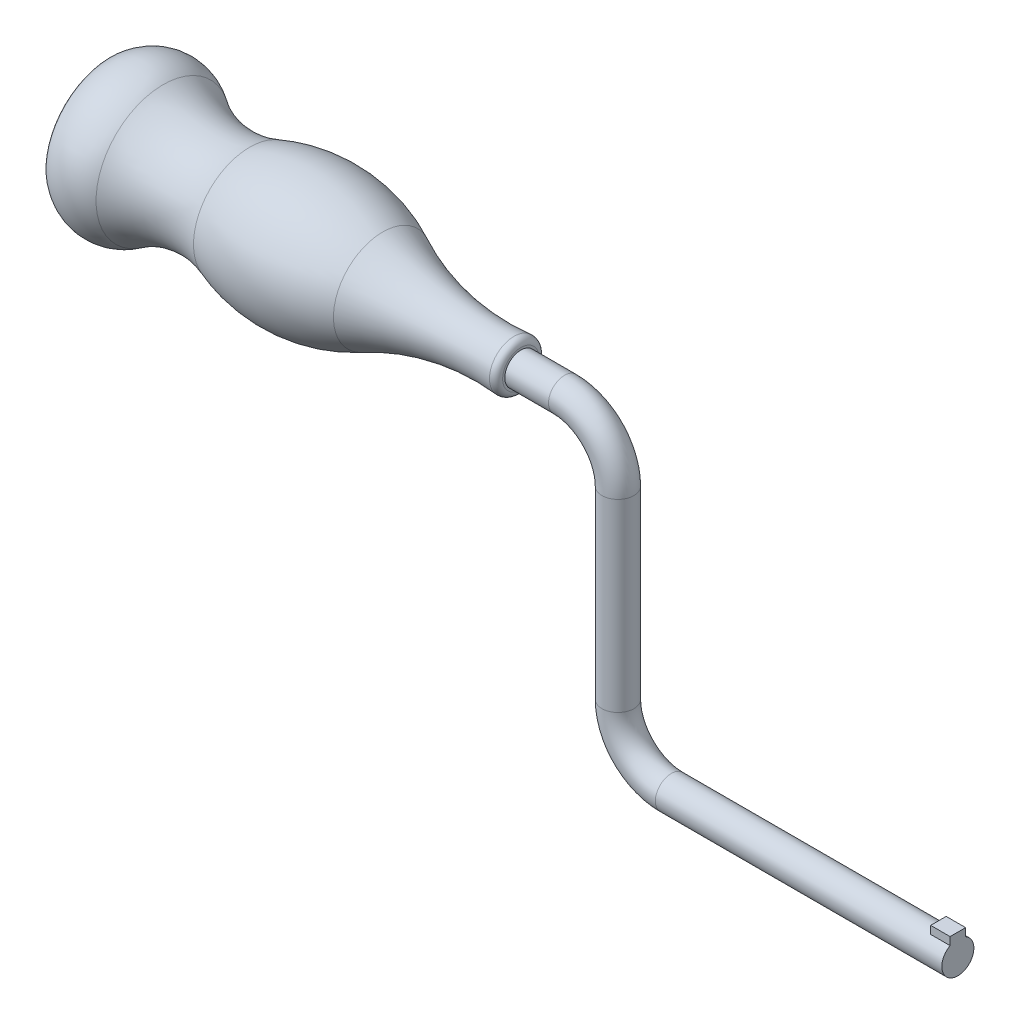
ISO-10303-21;
HEADER;
FILE_DESCRIPTION(('STEP AP214'),'2;1');
FILE_NAME('part.step','',(''),(''),'','','');
FILE_SCHEMA(('AUTOMOTIVE_DESIGN { 1 0 10303 214 1 1 1 1 }'));
ENDSEC;
DATA;
#1=APPLICATION_CONTEXT('core data for automotive mechanical design processes');
#2=APPLICATION_PROTOCOL_DEFINITION('international standard','automotive_design',2000,#1);
#3=PRODUCT_CONTEXT('',#1,'mechanical');
#4=PRODUCT('Part','Part','',(#3));
#5=PRODUCT_RELATED_PRODUCT_CATEGORY('part','',(#4));
#6=PRODUCT_DEFINITION_FORMATION('','',#4);
#7=PRODUCT_DEFINITION_CONTEXT('part definition',#1,'design');
#8=PRODUCT_DEFINITION('design','',#6,#7);
#9=PRODUCT_DEFINITION_SHAPE('','',#8);
#10=(LENGTH_UNIT() NAMED_UNIT(*) SI_UNIT(.MILLI.,.METRE.));
#11=(NAMED_UNIT(*) PLANE_ANGLE_UNIT() SI_UNIT($,.RADIAN.));
#12=(NAMED_UNIT(*) SI_UNIT($,.STERADIAN.) SOLID_ANGLE_UNIT());
#13=UNCERTAINTY_MEASURE_WITH_UNIT(LENGTH_MEASURE(1.E-05),#10,'distance_accuracy_value','');
#14=(GEOMETRIC_REPRESENTATION_CONTEXT(3) GLOBAL_UNCERTAINTY_ASSIGNED_CONTEXT((#13)) GLOBAL_UNIT_ASSIGNED_CONTEXT((#10,
#11,#12)) REPRESENTATION_CONTEXT('',''));
#15=CARTESIAN_POINT('',(0.,0.,0.));
#16=DIRECTION('',(0.,0.,1.));
#17=DIRECTION('',(1.,0.,0.));
#18=AXIS2_PLACEMENT_3D('',#15,#16,#17);
#19=CARTESIAN_POINT('',(-24.13,313.435579419438,0.));
#20=DIRECTION('',(1.,0.,0.));
#21=DIRECTION('',(0.,1.,0.));
#22=AXIS2_PLACEMENT_3D('',#19,#20,#21);
#23=CYLINDRICAL_SURFACE('',#22,2.0955);
#24=CARTESIAN_POINT('',(-24.13,313.435579419438,0.));
#25=DIRECTION('',(-1.,0.,0.));
#26=DIRECTION('',(0.,0.,1.));
#27=AXIS2_PLACEMENT_3D('',#24,#25,#26);
#28=CIRCLE('',#27,2.0955);
#29=CARTESIAN_POINT('',(-24.13,311.340079419438,0.));
#30=VERTEX_POINT('',#29);
#31=EDGE_CURVE('E119',#30,#30,#28,.T.);
#32=ORIENTED_EDGE('',*,*,#31,.F.);
#33=EDGE_LOOP('',(#32));
#34=FACE_BOUND('',#33,.T.);
#35=CARTESIAN_POINT('',(13.335,313.435579419438,0.));
#36=DIRECTION('',(-1.,0.,0.));
#37=DIRECTION('',(0.,0.,1.));
#38=AXIS2_PLACEMENT_3D('',#35,#36,#37);
#39=CIRCLE('',#38,2.0955);
#40=CARTESIAN_POINT('',(13.335,315.268299870025,-1.016));
#41=VERTEX_POINT('',#40);
#42=CARTESIAN_POINT('',(13.335,315.268299870025,1.016));
#43=VERTEX_POINT('',#42);
#44=EDGE_CURVE('E41',#41,#43,#39,.T.);
#45=ORIENTED_EDGE('',*,*,#44,.T.);
#46=DIRECTION('',(1.,0.,0.));
#47=VECTOR('',#46,1.);
#48=CARTESIAN_POINT('',(-24.13,315.268299870025,1.016));
#49=LINE('',#48,#47);
#50=CARTESIAN_POINT('',(10.795,315.268299870025,1.016));
#51=VERTEX_POINT('',#50);
#52=EDGE_CURVE('E48',#43,#51,#49,.F.);
#53=ORIENTED_EDGE('',*,*,#52,.T.);
#54=CARTESIAN_POINT('',(10.795,313.435579419438,0.));
#55=DIRECTION('',(1.,0.,0.));
#56=DIRECTION('',(0.,0.,-1.));
#57=AXIS2_PLACEMENT_3D('',#54,#55,#56);
#58=CIRCLE('',#57,2.0955);
#59=CARTESIAN_POINT('',(10.795,315.268299870025,-1.016));
#60=VERTEX_POINT('',#59);
#61=EDGE_CURVE('E11',#60,#51,#58,.T.);
#62=ORIENTED_EDGE('',*,*,#61,.F.);
#63=DIRECTION('',(1.,0.,0.));
#64=VECTOR('',#63,1.);
#65=CARTESIAN_POINT('',(-24.13,315.268299870025,-1.016));
#66=LINE('',#65,#64);
#67=EDGE_CURVE('E52',#41,#60,#66,.F.);
#68=ORIENTED_EDGE('',*,*,#67,.F.);
#69=EDGE_LOOP('',(#45,#53,#62,#68));
#70=FACE_BOUND('',#69,.T.);
#71=ADVANCED_FACE('F34',(#34,#70),#23,.T.);
#72=CARTESIAN_POINT('',(-24.13,320.420579419438,0.));
#73=DIRECTION('',(0.,0.,1.));
#74=DIRECTION('',(1.,0.,0.));
#75=AXIS2_PLACEMENT_3D('',#72,#73,#74);
#76=TOROIDAL_SURFACE('',#75,6.98499999999995,2.0955);
#77=CARTESIAN_POINT('',(-31.115,320.420579419438,0.));
#78=DIRECTION('',(0.,1.,0.));
#79=DIRECTION('',(0.,0.,1.));
#80=AXIS2_PLACEMENT_3D('',#77,#78,#79);
#81=CIRCLE('',#80,2.0955);
#82=CARTESIAN_POINT('',(-33.2105,320.420579419438,0.));
#83=VERTEX_POINT('',#82);
#84=EDGE_CURVE('E116',#83,#83,#81,.T.);
#85=CARTESIAN_POINT('',(-24.13,320.420579419438,0.));
#86=DIRECTION('',(0.,0.,1.));
#87=DIRECTION('',(1.,0.,0.));
#88=AXIS2_PLACEMENT_3D('',#85,#86,#87);
#89=CIRCLE('',#88,9.08049999999995);
#90=EDGE_CURVE('',#83,#30,#89,.T.);
#91=ORIENTED_EDGE('',*,*,#84,.F.);
#92=ORIENTED_EDGE('',*,*,#31,.T.);
#93=ORIENTED_EDGE('',*,*,#90,.T.);
#94=ORIENTED_EDGE('',*,*,#90,.F.);
#95=EDGE_LOOP('',(#91,#93,#92,#94));
#96=FACE_BOUND('',#95,.T.);
#97=ADVANCED_FACE('F137',(#96),#76,.T.);
#98=CARTESIAN_POINT('',(-31.115,344.550579419438,0.));
#99=DIRECTION('',(0.,-1.,0.));
#100=DIRECTION('',(1.,0.,0.));
#101=AXIS2_PLACEMENT_3D('',#98,#99,#100);
#102=CYLINDRICAL_SURFACE('',#101,2.0955);
#103=CARTESIAN_POINT('',(-31.115,344.550579419438,0.));
#104=DIRECTION('',(0.,1.,0.));
#105=DIRECTION('',(0.,0.,1.));
#106=AXIS2_PLACEMENT_3D('',#103,#104,#105);
#107=CIRCLE('',#106,2.0955);
#108=CARTESIAN_POINT('',(-29.0195,344.550579419438,0.));
#109=VERTEX_POINT('',#108);
#110=EDGE_CURVE('E113',#109,#109,#107,.T.);
#111=ORIENTED_EDGE('',*,*,#110,.F.);
#112=EDGE_LOOP('',(#111));
#113=FACE_BOUND('',#112,.T.);
#114=ORIENTED_EDGE('',*,*,#84,.T.);
#115=EDGE_LOOP('',(#114));
#116=FACE_BOUND('',#115,.T.);
#117=ADVANCED_FACE('F142',(#113,#116),#102,.T.);
#118=CARTESIAN_POINT('',(-38.1,344.550579419438,0.));
#119=DIRECTION('',(0.,0.,-1.));
#120=DIRECTION('',(-1.,0.,0.));
#121=AXIS2_PLACEMENT_3D('',#118,#119,#120);
#122=TOROIDAL_SURFACE('',#121,6.98500000000002,2.0955);
#123=CARTESIAN_POINT('',(-38.1,351.535579419438,0.));
#124=DIRECTION('',(-1.,0.,0.));
#125=DIRECTION('',(0.,0.,1.));
#126=AXIS2_PLACEMENT_3D('',#123,#124,#125);
#127=CIRCLE('',#126,2.0955);
#128=CARTESIAN_POINT('',(-38.1,353.631079419438,0.));
#129=VERTEX_POINT('',#128);
#130=EDGE_CURVE('E110',#129,#129,#127,.T.);
#131=CARTESIAN_POINT('',(-38.1,344.550579419438,0.));
#132=DIRECTION('',(0.,0.,-1.));
#133=DIRECTION('',(-1.,0.,0.));
#134=AXIS2_PLACEMENT_3D('',#131,#132,#133);
#135=CIRCLE('',#134,9.08050000000001);
#136=EDGE_CURVE('',#129,#109,#135,.T.);
#137=ORIENTED_EDGE('',*,*,#130,.F.);
#138=ORIENTED_EDGE('',*,*,#110,.T.);
#139=ORIENTED_EDGE('',*,*,#136,.T.);
#140=ORIENTED_EDGE('',*,*,#136,.F.);
#141=EDGE_LOOP('',(#137,#139,#138,#140));
#142=FACE_BOUND('',#141,.T.);
#143=ADVANCED_FACE('F149',(#142),#122,.T.);
#144=CARTESIAN_POINT('',(-38.1,351.535579419438,0.));
#145=DIRECTION('',(-1.,0.,0.));
#146=DIRECTION('',(0.,-1.,0.));
#147=AXIS2_PLACEMENT_3D('',#144,#145,#146);
#148=CYLINDRICAL_SURFACE('',#147,2.0955);
#149=ORIENTED_EDGE('',*,*,#130,.T.);
#150=EDGE_LOOP('',(#149));
#151=FACE_BOUND('',#150,.T.);
#152=CARTESIAN_POINT('',(-43.815,351.535579419438,0.));
#153=DIRECTION('',(-1.,0.,0.));
#154=DIRECTION('',(0.,0.,1.));
#155=AXIS2_PLACEMENT_3D('',#152,#153,#154);
#156=CIRCLE('',#155,2.0955);
#157=CARTESIAN_POINT('',(-43.815,351.535579419438,2.0955));
#158=VERTEX_POINT('',#157);
#159=EDGE_CURVE('E107',#158,#158,#156,.T.);
#160=ORIENTED_EDGE('',*,*,#159,.F.);
#161=EDGE_LOOP('',(#160));
#162=FACE_BOUND('',#161,.T.);
#163=ADVANCED_FACE('F133',(#151,#162),#148,.T.);
#164=CARTESIAN_POINT('',(13.335,313.435579419438,0.));
#165=DIRECTION('',(-1.,0.,0.));
#166=DIRECTION('',(0.,0.,1.));
#167=AXIS2_PLACEMENT_3D('',#164,#165,#166);
#168=PLANE('',#167);
#169=ORIENTED_EDGE('',*,*,#44,.F.);
#170=DIRECTION('',(0.,1.,0.));
#171=VECTOR('',#170,1.);
#172=CARTESIAN_POINT('',(13.335,315.531079419438,-1.016));
#173=LINE('',#172,#171);
#174=CARTESIAN_POINT('',(13.335,316.293079419438,-1.016));
#175=VERTEX_POINT('',#174);
#176=EDGE_CURVE('E72',#41,#175,#173,.T.);
#177=ORIENTED_EDGE('',*,*,#176,.T.);
#178=DIRECTION('',(0.,0.,-1.));
#179=VECTOR('',#178,1.);
#180=CARTESIAN_POINT('',(13.335,316.293079419438,1.016));
#181=LINE('',#180,#179);
#182=CARTESIAN_POINT('',(13.335,316.293079419438,1.016));
#183=VERTEX_POINT('',#182);
#184=EDGE_CURVE('E76',#183,#175,#181,.T.);
#185=ORIENTED_EDGE('',*,*,#184,.F.);
#186=DIRECTION('',(0.,1.,0.));
#187=VECTOR('',#186,1.);
#188=CARTESIAN_POINT('',(13.335,315.150079419438,1.016));
#189=LINE('',#188,#187);
#190=EDGE_CURVE('E95',#43,#183,#189,.T.);
#191=ORIENTED_EDGE('',*,*,#190,.F.);
#192=EDGE_LOOP('',(#169,#177,#185,#191));
#193=FACE_BOUND('',#192,.T.);
#194=ADVANCED_FACE('F74',(#193),#168,.F.);
#195=CARTESIAN_POINT('',(10.795,315.531079419438,1.016));
#196=DIRECTION('',(1.,0.,0.));
#197=DIRECTION('',(0.,0.,-1.));
#198=AXIS2_PLACEMENT_3D('',#195,#196,#197);
#199=PLANE('',#198);
#200=DIRECTION('',(0.,-1.,0.));
#201=VECTOR('',#200,1.);
#202=CARTESIAN_POINT('',(10.795,315.531079419438,-1.016));
#203=LINE('',#202,#201);
#204=CARTESIAN_POINT('',(10.795,316.293079419438,-1.016));
#205=VERTEX_POINT('',#204);
#206=EDGE_CURVE('E93',#205,#60,#203,.T.);
#207=ORIENTED_EDGE('',*,*,#206,.T.);
#208=ORIENTED_EDGE('',*,*,#61,.T.);
#209=DIRECTION('',(0.,-1.,0.));
#210=VECTOR('',#209,1.);
#211=CARTESIAN_POINT('',(10.795,316.293079419438,1.016));
#212=LINE('',#211,#210);
#213=CARTESIAN_POINT('',(10.795,316.293079419438,1.016));
#214=VERTEX_POINT('',#213);
#215=EDGE_CURVE('E101',#214,#51,#212,.T.);
#216=ORIENTED_EDGE('',*,*,#215,.F.);
#217=DIRECTION('',(0.,0.,-1.));
#218=VECTOR('',#217,1.);
#219=CARTESIAN_POINT('',(10.795,316.293079419438,1.016));
#220=LINE('',#219,#218);
#221=EDGE_CURVE('E89',#214,#205,#220,.T.);
#222=ORIENTED_EDGE('',*,*,#221,.T.);
#223=EDGE_LOOP('',(#207,#208,#216,#222));
#224=FACE_BOUND('',#223,.T.);
#225=ADVANCED_FACE('F125',(#224),#199,.F.);
#226=CARTESIAN_POINT('',(13.335,316.293079419438,1.016));
#227=DIRECTION('',(0.,0.,1.));
#228=DIRECTION('',(1.,0.,0.));
#229=AXIS2_PLACEMENT_3D('',#226,#227,#228);
#230=PLANE('',#229);
#231=ORIENTED_EDGE('',*,*,#52,.F.);
#232=ORIENTED_EDGE('',*,*,#190,.T.);
#233=DIRECTION('',(-1.,0.,0.));
#234=VECTOR('',#233,1.);
#235=CARTESIAN_POINT('',(13.335,316.293079419438,1.016));
#236=LINE('',#235,#234);
#237=EDGE_CURVE('E88',#183,#214,#236,.T.);
#238=ORIENTED_EDGE('',*,*,#237,.T.);
#239=ORIENTED_EDGE('',*,*,#215,.T.);
#240=EDGE_LOOP('',(#231,#232,#238,#239));
#241=FACE_BOUND('',#240,.T.);
#242=ADVANCED_FACE('F122',(#241),#230,.T.);
#243=CARTESIAN_POINT('',(13.335,316.293079419438,-1.016));
#244=DIRECTION('',(0.,0.,1.));
#245=DIRECTION('',(1.,0.,0.));
#246=AXIS2_PLACEMENT_3D('',#243,#244,#245);
#247=PLANE('',#246);
#248=ORIENTED_EDGE('',*,*,#176,.F.);
#249=ORIENTED_EDGE('',*,*,#67,.T.);
#250=ORIENTED_EDGE('',*,*,#206,.F.);
#251=DIRECTION('',(-1.,0.,0.));
#252=VECTOR('',#251,1.);
#253=CARTESIAN_POINT('',(13.335,316.293079419438,-1.016));
#254=LINE('',#253,#252);
#255=EDGE_CURVE('E80',#175,#205,#254,.T.);
#256=ORIENTED_EDGE('',*,*,#255,.F.);
#257=EDGE_LOOP('',(#248,#249,#250,#256));
#258=FACE_BOUND('',#257,.T.);
#259=ADVANCED_FACE('F91',(#258),#247,.F.);
#260=CARTESIAN_POINT('',(13.335,316.293079419438,1.016));
#261=DIRECTION('',(0.,-1.,0.));
#262=DIRECTION('',(0.,0.,-1.));
#263=AXIS2_PLACEMENT_3D('',#260,#261,#262);
#264=PLANE('',#263);
#265=ORIENTED_EDGE('',*,*,#255,.T.);
#266=ORIENTED_EDGE('',*,*,#221,.F.);
#267=ORIENTED_EDGE('',*,*,#237,.F.);
#268=ORIENTED_EDGE('',*,*,#184,.T.);
#269=EDGE_LOOP('',(#265,#266,#267,#268));
#270=FACE_BOUND('',#269,.T.);
#271=ADVANCED_FACE('F85',(#270),#264,.F.);
#272=CARTESIAN_POINT('',(-43.815,351.535579419438,0.));
#273=DIRECTION('',(1.,0.,0.));
#274=DIRECTION('',(0.,0.,-1.));
#275=AXIS2_PLACEMENT_3D('',#272,#273,#274);
#276=PLANE('',#275);
#277=ORIENTED_EDGE('',*,*,#159,.T.);
#278=EDGE_LOOP('',(#277));
#279=FACE_BOUND('',#278,.T.);
#280=CARTESIAN_POINT('',(-43.815,351.535579419438,0.));
#281=DIRECTION('',(1.,0.,0.));
#282=DIRECTION('',(0.,0.,-1.));
#283=AXIS2_PLACEMENT_3D('',#280,#281,#282);
#284=CIRCLE('',#283,2.38063889089807);
#285=CARTESIAN_POINT('',(-43.815,351.535579419438,-2.38063889089807));
#286=VERTEX_POINT('',#285);
#287=EDGE_CURVE('E81',#286,#286,#284,.T.);
#288=ORIENTED_EDGE('',*,*,#287,.T.);
#289=EDGE_LOOP('',(#288));
#290=FACE_BOUND('',#289,.T.);
#291=ADVANCED_FACE('F160',(#279,#290),#276,.T.);
#292=CARTESIAN_POINT('',(-44.6405,351.535579419438,0.));
#293=DIRECTION('',(1.,0.,0.));
#294=DIRECTION('',(0.,0.,-1.));
#295=AXIS2_PLACEMENT_3D('',#292,#293,#294);
#296=TOROIDAL_SURFACE('',#295,2.38063889089807,0.825500000000006);
#297=CARTESIAN_POINT('',(-44.7116593328935,351.535579419438,0.));
#298=DIRECTION('',(1.,0.,0.));
#299=DIRECTION('',(0.,0.,-1.));
#300=AXIS2_PLACEMENT_3D('',#297,#298,#299);
#301=CIRCLE('',#300,3.20306615171945);
#302=CARTESIAN_POINT('',(-44.7116593328935,351.535579419438,-3.20306615171945));
#303=VERTEX_POINT('',#302);
#304=EDGE_CURVE('E217',#303,#303,#301,.T.);
#305=ORIENTED_EDGE('',*,*,#304,.T.);
#306=EDGE_LOOP('',(#305));
#307=FACE_BOUND('',#306,.T.);
#308=ORIENTED_EDGE('',*,*,#287,.F.);
#309=EDGE_LOOP('',(#308));
#310=FACE_BOUND('',#309,.T.);
#311=ADVANCED_FACE('F165',(#307,#310),#296,.T.);
#312=CARTESIAN_POINT('',(-47.507349994,351.535579419438,0.));
#313=DIRECTION('',(1.,0.,0.));
#314=DIRECTION('',(0.,0.,-1.));
#315=AXIS2_PLACEMENT_3D('',#312,#313,#314);
#316=TOROIDAL_SURFACE('',#315,35.514389474,32.432044356);
#317=CARTESIAN_POINT('',(-61.8800813054943,351.535579419438,0.));
#318=DIRECTION('',(1.,0.,0.));
#319=DIRECTION('',(0.,0.,-1.));
#320=AXIS2_PLACEMENT_3D('',#317,#318,#319);
#321=CIRCLE('',#320,6.44099793195352);
#322=CARTESIAN_POINT('',(-61.8800813054943,351.535579419438,-6.44099793195352));
#323=VERTEX_POINT('',#322);
#324=EDGE_CURVE('E214',#323,#323,#321,.T.);
#325=ORIENTED_EDGE('',*,*,#324,.T.);
#326=EDGE_LOOP('',(#325));
#327=FACE_BOUND('',#326,.T.);
#328=ORIENTED_EDGE('',*,*,#304,.F.);
#329=EDGE_LOOP('',(#328));
#330=FACE_BOUND('',#329,.T.);
#331=ADVANCED_FACE('F174',(#327,#330),#316,.F.);
#332=CARTESIAN_POINT('',(-71.62972974,351.535579419438,0.));
#333=DIRECTION('',(1.,0.,0.));
#334=DIRECTION('',(0.,0.,-1.));
#335=AXIS2_PLACEMENT_3D('',#332,#333,#334);
#336=DEGENERATE_TOROIDAL_SURFACE('',#335,13.2807473779999,22.0000655150645,.F.);
#337=CARTESIAN_POINT('',(-79.2690744265261,351.535579419438,0.));
#338=DIRECTION('',(1.,0.,0.));
#339=DIRECTION('',(0.,0.,-1.));
#340=AXIS2_PLACEMENT_3D('',#337,#338,#339);
#341=CIRCLE('',#340,7.35037705639718);
#342=CARTESIAN_POINT('',(-79.2690744265261,351.535579419438,-7.35037705639718));
#343=VERTEX_POINT('',#342);
#344=EDGE_CURVE('E211',#343,#343,#341,.T.);
#345=ORIENTED_EDGE('',*,*,#344,.T.);
#346=EDGE_LOOP('',(#345));
#347=FACE_BOUND('',#346,.T.);
#348=ORIENTED_EDGE('',*,*,#324,.F.);
#349=EDGE_LOOP('',(#348));
#350=FACE_BOUND('',#349,.T.);
#351=ADVANCED_FACE('F178',(#347,#350),#336,.F.);
#352=CARTESIAN_POINT('',(-83.554287552,351.535579419438,0.));
#353=DIRECTION('',(1.,0.,0.));
#354=DIRECTION('',(0.,0.,-1.));
#355=AXIS2_PLACEMENT_3D('',#352,#353,#354);
#356=TOROIDAL_SURFACE('',#355,18.9231976120001,12.3407142071648);
#357=CARTESIAN_POINT('',(-90.5832445106409,351.535579419438,0.));
#358=DIRECTION('',(1.,0.,0.));
#359=DIRECTION('',(0.,0.,-1.));
#360=AXIS2_PLACEMENT_3D('',#357,#358,#359);
#361=CIRCLE('',#360,8.77987511803924);
#362=CARTESIAN_POINT('',(-90.5832445106409,351.535579419438,-8.77987511803924));
#363=VERTEX_POINT('',#362);
#364=EDGE_CURVE('E206',#363,#363,#361,.T.);
#365=ORIENTED_EDGE('',*,*,#364,.T.);
#366=EDGE_LOOP('',(#365));
#367=FACE_BOUND('',#366,.T.);
#368=ORIENTED_EDGE('',*,*,#344,.F.);
#369=EDGE_LOOP('',(#368));
#370=FACE_BOUND('',#369,.T.);
#371=ADVANCED_FACE('F182',(#367,#370),#356,.F.);
#372=CARTESIAN_POINT('',(-93.8110440387538,351.535579419438,0.));
#373=DIRECTION('',(1.,0.,0.));
#374=DIRECTION('',(0.,0.,-1.));
#375=AXIS2_PLACEMENT_3D('',#372,#373,#374);
#376=DEGENERATE_TOROIDAL_SURFACE('',#375,4.12191352399999,5.66703591000002,.T.);
#377=CARTESIAN_POINT('',(-97.3694928613526,351.535579419438,0.));
#378=DIRECTION('',(1.,0.,0.));
#379=DIRECTION('',(0.,0.,-1.));
#380=AXIS2_PLACEMENT_3D('',#377,#378,#379);
#381=CIRCLE('',#380,8.53243934097181);
#382=CARTESIAN_POINT('',(-97.3694928613526,351.535579419438,-8.53243934097181));
#383=VERTEX_POINT('',#382);
#384=EDGE_CURVE('E203',#383,#383,#381,.T.);
#385=ORIENTED_EDGE('',*,*,#384,.T.);
#386=EDGE_LOOP('',(#385));
#387=FACE_BOUND('',#386,.T.);
#388=ORIENTED_EDGE('',*,*,#364,.F.);
#389=EDGE_LOOP('',(#388));
#390=FACE_BOUND('',#389,.T.);
#391=ADVANCED_FACE('F186',(#387,#390),#376,.T.);
#392=CARTESIAN_POINT('',(-96.851144372,351.535579419438,0.));
#393=DIRECTION('',(1.,0.,0.));
#394=DIRECTION('',(0.,0.,-1.));
#395=AXIS2_PLACEMENT_3D('',#392,#393,#394);
#396=TOROIDAL_SURFACE('',#395,7.88997137010794,0.825499999999992);
#397=CARTESIAN_POINT('',(-97.676644372,351.535579419438,0.));
#398=DIRECTION('',(1.,0.,0.));
#399=DIRECTION('',(0.,0.,-1.));
#400=AXIS2_PLACEMENT_3D('',#397,#398,#399);
#401=CIRCLE('',#400,7.88997137010794);
#402=CARTESIAN_POINT('',(-97.676644372,351.535579419438,-7.88997137010794));
#403=VERTEX_POINT('',#402);
#404=EDGE_CURVE('E202',#403,#403,#401,.T.);
#405=ORIENTED_EDGE('',*,*,#404,.T.);
#406=EDGE_LOOP('',(#405));
#407=FACE_BOUND('',#406,.T.);
#408=ORIENTED_EDGE('',*,*,#384,.F.);
#409=EDGE_LOOP('',(#408));
#410=FACE_BOUND('',#409,.T.);
#411=ADVANCED_FACE('F190',(#407,#410),#396,.T.);
#412=CARTESIAN_POINT('',(-97.676644372,359.425550789546,0.));
#413=DIRECTION('',(-1.,0.,0.));
#414=DIRECTION('',(0.,0.,1.));
#415=AXIS2_PLACEMENT_3D('',#412,#413,#414);
#416=PLANE('',#415);
#417=ORIENTED_EDGE('',*,*,#404,.F.);
#418=EDGE_LOOP('',(#417));
#419=FACE_BOUND('',#418,.T.);
#420=ADVANCED_FACE('F194',(#419),#416,.T.);
#421=CLOSED_SHELL('',(#71,#97,#117,#143,#163,#194,#225,#242,#259,#271,#291,#311,#331,#351,#371,
#391,#411,#420));
#422=MANIFOLD_SOLID_BREP('B2',#421);
#423=ADVANCED_BREP_SHAPE_REPRESENTATION('',(#18,#422),#14);
#424=SHAPE_DEFINITION_REPRESENTATION(#9,#423);
ENDSEC;
END-ISO-10303-21;
